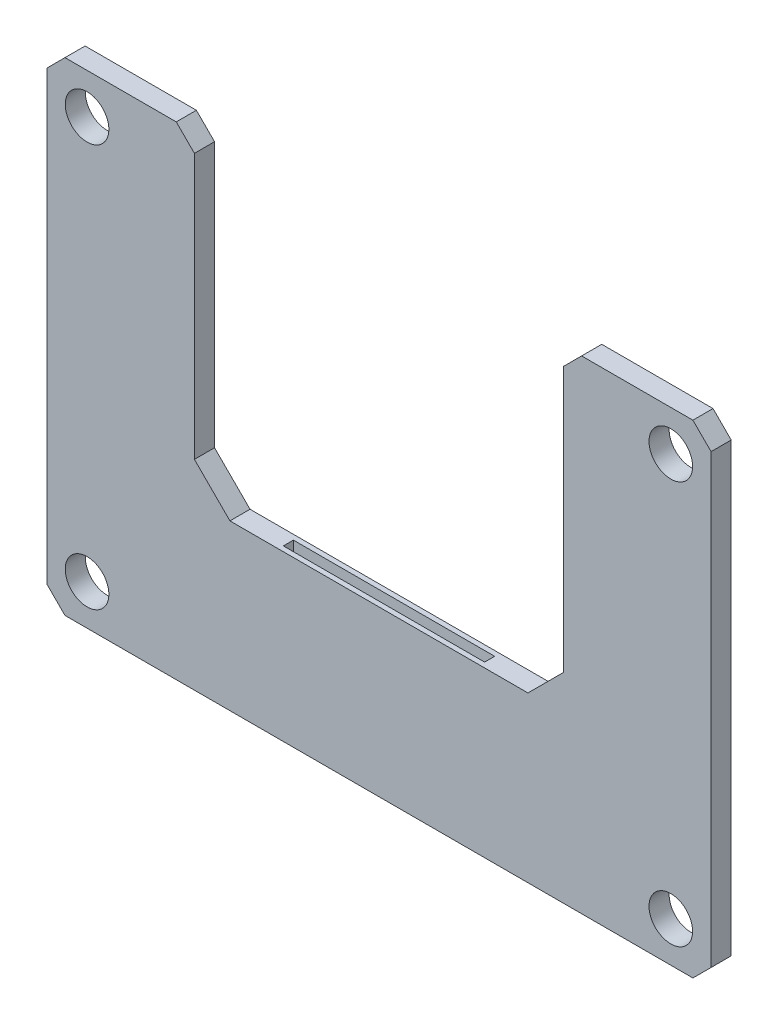
ISO-10303-21;
HEADER;
FILE_DESCRIPTION(('STEP AP214'),'2;1');
FILE_NAME('part.step','',(''),(''),'','','');
FILE_SCHEMA(('AUTOMOTIVE_DESIGN { 1 0 10303 214 1 1 1 1 }'));
ENDSEC;
DATA;
#1=APPLICATION_CONTEXT('core data for automotive mechanical design processes');
#2=APPLICATION_PROTOCOL_DEFINITION('international standard','automotive_design',2000,#1);
#3=PRODUCT_CONTEXT('',#1,'mechanical');
#4=PRODUCT('Part','Part','',(#3));
#5=PRODUCT_RELATED_PRODUCT_CATEGORY('part','',(#4));
#6=PRODUCT_DEFINITION_FORMATION('','',#4);
#7=PRODUCT_DEFINITION_CONTEXT('part definition',#1,'design');
#8=PRODUCT_DEFINITION('design','',#6,#7);
#9=PRODUCT_DEFINITION_SHAPE('','',#8);
#10=(LENGTH_UNIT() NAMED_UNIT(*) SI_UNIT(.MILLI.,.METRE.));
#11=(NAMED_UNIT(*) PLANE_ANGLE_UNIT() SI_UNIT($,.RADIAN.));
#12=(NAMED_UNIT(*) SI_UNIT($,.STERADIAN.) SOLID_ANGLE_UNIT());
#13=UNCERTAINTY_MEASURE_WITH_UNIT(LENGTH_MEASURE(1.E-05),#10,'distance_accuracy_value','');
#14=(GEOMETRIC_REPRESENTATION_CONTEXT(3) GLOBAL_UNCERTAINTY_ASSIGNED_CONTEXT((#13)) GLOBAL_UNIT_ASSIGNED_CONTEXT((#10,
#11,#12)) REPRESENTATION_CONTEXT('',''));
#15=CARTESIAN_POINT('',(0.,0.,0.));
#16=DIRECTION('',(0.,0.,1.));
#17=DIRECTION('',(1.,0.,0.));
#18=AXIS2_PLACEMENT_3D('',#15,#16,#17);
#19=CARTESIAN_POINT('',(0.,0.,3.));
#20=DIRECTION('',(0.,0.,-1.));
#21=DIRECTION('',(-1.,0.,0.));
#22=AXIS2_PLACEMENT_3D('',#19,#20,#21);
#23=PLANE('',#22);
#24=DIRECTION('',(-0.707106781186538,-0.707106781186557,0.));
#25=VECTOR('',#24,1.);
#26=CARTESIAN_POINT('',(-22.5,30.2928932188135,3.));
#27=LINE('',#26,#25);
#28=CARTESIAN_POINT('',(-22.5,30.2928932188135,3.));
#29=VERTEX_POINT('',#28);
#30=CARTESIAN_POINT('',(-27.7928932188133,25.,3.));
#31=VERTEX_POINT('',#30);
#32=EDGE_CURVE('E231',#29,#31,#27,.T.);
#33=ORIENTED_EDGE('',*,*,#32,.T.);
#34=DIRECTION('',(-1.,0.,0.));
#35=VECTOR('',#34,1.);
#36=CARTESIAN_POINT('',(-27.7928932188133,25.,3.));
#37=LINE('',#36,#35);
#38=CARTESIAN_POINT('',(-72.2071067811864,25.,3.));
#39=VERTEX_POINT('',#38);
#40=EDGE_CURVE('E234',#31,#39,#37,.T.);
#41=ORIENTED_EDGE('',*,*,#40,.T.);
#42=DIRECTION('',(-0.707106781186558,0.707106781186537,0.));
#43=VECTOR('',#42,1.);
#44=CARTESIAN_POINT('',(-72.2071067811864,25.,3.));
#45=LINE('',#44,#43);
#46=CARTESIAN_POINT('',(-77.5,30.2928932188134,3.));
#47=VERTEX_POINT('',#46);
#48=EDGE_CURVE('E237',#39,#47,#45,.T.);
#49=ORIENTED_EDGE('',*,*,#48,.T.);
#50=DIRECTION('',(0.,1.,0.));
#51=VECTOR('',#50,1.);
#52=CARTESIAN_POINT('',(-77.5,30.2928932188134,3.));
#53=LINE('',#52,#51);
#54=CARTESIAN_POINT('',(-77.5,69.7928932188135,3.));
#55=VERTEX_POINT('',#54);
#56=EDGE_CURVE('E239',#47,#55,#53,.T.);
#57=ORIENTED_EDGE('',*,*,#56,.T.);
#58=DIRECTION('',(-0.707106781186544,0.707106781186551,0.));
#59=VECTOR('',#58,1.);
#60=CARTESIAN_POINT('',(-77.5,69.7928932188135,3.));
#61=LINE('',#60,#59);
#62=CARTESIAN_POINT('',(-80.2071067811865,72.5,3.));
#63=VERTEX_POINT('',#62);
#64=EDGE_CURVE('E241',#55,#63,#61,.T.);
#65=ORIENTED_EDGE('',*,*,#64,.T.);
#66=DIRECTION('',(-1.,0.,0.));
#67=VECTOR('',#66,1.);
#68=CARTESIAN_POINT('',(-80.2071067811865,72.5,3.));
#69=LINE('',#68,#67);
#70=CARTESIAN_POINT('',(-96.7928932188135,72.5,3.));
#71=VERTEX_POINT('',#70);
#72=EDGE_CURVE('E243',#63,#71,#69,.T.);
#73=ORIENTED_EDGE('',*,*,#72,.T.);
#74=DIRECTION('',(-0.707106781186544,-0.707106781186551,0.));
#75=VECTOR('',#74,1.);
#76=CARTESIAN_POINT('',(-96.7928932188135,72.5,3.));
#77=LINE('',#76,#75);
#78=CARTESIAN_POINT('',(-99.5,69.7928932188134,3.));
#79=VERTEX_POINT('',#78);
#80=EDGE_CURVE('E245',#71,#79,#77,.T.);
#81=ORIENTED_EDGE('',*,*,#80,.T.);
#82=DIRECTION('',(0.,-1.,0.));
#83=VECTOR('',#82,1.);
#84=CARTESIAN_POINT('',(-99.5,69.7928932188134,3.));
#85=LINE('',#84,#83);
#86=CARTESIAN_POINT('',(-99.5,3.20710678118654,3.));
#87=VERTEX_POINT('',#86);
#88=EDGE_CURVE('E247',#79,#87,#85,.T.);
#89=ORIENTED_EDGE('',*,*,#88,.T.);
#90=DIRECTION('',(0.707106781186548,-0.707106781186547,0.));
#91=VECTOR('',#90,1.);
#92=CARTESIAN_POINT('',(-99.5,3.20710678118654,3.));
#93=LINE('',#92,#91);
#94=CARTESIAN_POINT('',(-96.7928932188135,0.499999999999987,3.));
#95=VERTEX_POINT('',#94);
#96=EDGE_CURVE('E249',#87,#95,#93,.T.);
#97=ORIENTED_EDGE('',*,*,#96,.T.);
#98=DIRECTION('',(1.,0.,0.));
#99=VECTOR('',#98,1.);
#100=CARTESIAN_POINT('',(-96.7928932188135,0.499999999999987,3.));
#101=LINE('',#100,#99);
#102=CARTESIAN_POINT('',(-3.20710678118658,0.499999999999998,3.));
#103=VERTEX_POINT('',#102);
#104=EDGE_CURVE('E251',#95,#103,#101,.T.);
#105=ORIENTED_EDGE('',*,*,#104,.T.);
#106=DIRECTION('',(0.707106781186547,0.707106781186547,0.));
#107=VECTOR('',#106,1.);
#108=CARTESIAN_POINT('',(-3.20710678118658,0.499999999999998,3.));
#109=LINE('',#108,#107);
#110=CARTESIAN_POINT('',(-0.499999999999998,3.20710678118658,3.));
#111=VERTEX_POINT('',#110);
#112=EDGE_CURVE('E253',#103,#111,#109,.T.);
#113=ORIENTED_EDGE('',*,*,#112,.T.);
#114=DIRECTION('',(0.,1.,0.));
#115=VECTOR('',#114,1.);
#116=CARTESIAN_POINT('',(-0.499999999999998,3.20710678118658,3.));
#117=LINE('',#116,#115);
#118=CARTESIAN_POINT('',(-0.499999999999998,69.7928932188135,3.));
#119=VERTEX_POINT('',#118);
#120=EDGE_CURVE('E255',#111,#119,#117,.T.);
#121=ORIENTED_EDGE('',*,*,#120,.T.);
#122=DIRECTION('',(-0.707106781186551,0.707106781186544,0.));
#123=VECTOR('',#122,1.);
#124=CARTESIAN_POINT('',(-0.499999999999998,69.7928932188135,3.));
#125=LINE('',#124,#123);
#126=CARTESIAN_POINT('',(-3.20710678118656,72.5,3.));
#127=VERTEX_POINT('',#126);
#128=EDGE_CURVE('E257',#119,#127,#125,.T.);
#129=ORIENTED_EDGE('',*,*,#128,.T.);
#130=DIRECTION('',(-1.,0.,0.));
#131=VECTOR('',#130,1.);
#132=CARTESIAN_POINT('',(-3.20710678118656,72.5,3.));
#133=LINE('',#132,#131);
#134=CARTESIAN_POINT('',(-19.7928932188135,72.5,3.));
#135=VERTEX_POINT('',#134);
#136=EDGE_CURVE('E259',#127,#135,#133,.T.);
#137=ORIENTED_EDGE('',*,*,#136,.T.);
#138=DIRECTION('',(-0.707106781186552,-0.707106781186543,0.));
#139=VECTOR('',#138,1.);
#140=CARTESIAN_POINT('',(-19.7928932188135,72.5,3.));
#141=LINE('',#140,#139);
#142=CARTESIAN_POINT('',(-22.5,69.7928932188135,3.));
#143=VERTEX_POINT('',#142);
#144=EDGE_CURVE('E261',#135,#143,#141,.T.);
#145=ORIENTED_EDGE('',*,*,#144,.T.);
#146=DIRECTION('',(0.,-1.,0.));
#147=VECTOR('',#146,1.);
#148=CARTESIAN_POINT('',(-22.5,69.7928932188135,3.));
#149=LINE('',#148,#147);
#150=EDGE_CURVE('E263',#143,#29,#149,.T.);
#151=ORIENTED_EDGE('',*,*,#150,.T.);
#152=EDGE_LOOP('',(#33,#41,#49,#57,#65,#73,#81,#89,#97,#105,#113,#121,#129,#137,#145,#151));
#153=FACE_BOUND('',#152,.T.);
#154=CARTESIAN_POINT('',(-6.49999999999982,66.4999999999996,3.));
#155=DIRECTION('',(0.,0.,1.));
#156=DIRECTION('',(1.,0.,0.));
#157=AXIS2_PLACEMENT_3D('',#154,#155,#156);
#158=CIRCLE('',#157,3.25);
#159=CARTESIAN_POINT('',(-3.24999999999982,66.4999999999996,3.));
#160=VERTEX_POINT('',#159);
#161=EDGE_CURVE('E225',#160,#160,#158,.T.);
#162=ORIENTED_EDGE('',*,*,#161,.F.);
#163=EDGE_LOOP('',(#162));
#164=FACE_BOUND('',#163,.T.);
#165=CARTESIAN_POINT('',(-6.49999999999999,6.49999999999999,3.));
#166=DIRECTION('',(0.,0.,1.));
#167=DIRECTION('',(1.,0.,0.));
#168=AXIS2_PLACEMENT_3D('',#165,#166,#167);
#169=CIRCLE('',#168,3.25);
#170=CARTESIAN_POINT('',(-3.24999999999999,6.49999999999999,3.));
#171=VERTEX_POINT('',#170);
#172=EDGE_CURVE('E219',#171,#171,#169,.T.);
#173=ORIENTED_EDGE('',*,*,#172,.F.);
#174=EDGE_LOOP('',(#173));
#175=FACE_BOUND('',#174,.T.);
#176=CARTESIAN_POINT('',(-93.5,6.49999999999999,3.));
#177=DIRECTION('',(0.,0.,1.));
#178=DIRECTION('',(1.,0.,0.));
#179=AXIS2_PLACEMENT_3D('',#176,#177,#178);
#180=CIRCLE('',#179,3.25000000000001);
#181=CARTESIAN_POINT('',(-90.25,6.49999999999999,3.));
#182=VERTEX_POINT('',#181);
#183=EDGE_CURVE('E213',#182,#182,#180,.T.);
#184=ORIENTED_EDGE('',*,*,#183,.F.);
#185=EDGE_LOOP('',(#184));
#186=FACE_BOUND('',#185,.T.);
#187=CARTESIAN_POINT('',(-93.5,66.4999999999996,3.));
#188=DIRECTION('',(0.,0.,1.));
#189=DIRECTION('',(1.,0.,0.));
#190=AXIS2_PLACEMENT_3D('',#187,#188,#189);
#191=CIRCLE('',#190,3.25000000000001);
#192=CARTESIAN_POINT('',(-90.25,66.4999999999996,3.));
#193=VERTEX_POINT('',#192);
#194=EDGE_CURVE('E207',#193,#193,#191,.T.);
#195=ORIENTED_EDGE('',*,*,#194,.F.);
#196=EDGE_LOOP('',(#195));
#197=FACE_BOUND('',#196,.T.);
#198=ADVANCED_FACE('F33',(#153,#164,#175,#186,#197),#23,.F.);
#199=CARTESIAN_POINT('',(0.,0.,0.));
#200=DIRECTION('',(0.,0.,-1.));
#201=DIRECTION('',(-1.,0.,0.));
#202=AXIS2_PLACEMENT_3D('',#199,#200,#201);
#203=PLANE('',#202);
#204=CARTESIAN_POINT('',(-93.5,6.49999999999999,0.));
#205=DIRECTION('',(0.,0.,1.));
#206=DIRECTION('',(1.,0.,0.));
#207=AXIS2_PLACEMENT_3D('',#204,#205,#206);
#208=CIRCLE('',#207,3.25000000000001);
#209=CARTESIAN_POINT('',(-90.25,6.49999999999999,0.));
#210=VERTEX_POINT('',#209);
#211=EDGE_CURVE('E210',#210,#210,#208,.T.);
#212=ORIENTED_EDGE('',*,*,#211,.T.);
#213=EDGE_LOOP('',(#212));
#214=FACE_BOUND('',#213,.T.);
#215=CARTESIAN_POINT('',(-6.49999999999982,66.4999999999996,0.));
#216=DIRECTION('',(0.,0.,1.));
#217=DIRECTION('',(1.,0.,0.));
#218=AXIS2_PLACEMENT_3D('',#215,#216,#217);
#219=CIRCLE('',#218,3.25);
#220=CARTESIAN_POINT('',(-3.24999999999982,66.4999999999996,0.));
#221=VERTEX_POINT('',#220);
#222=EDGE_CURVE('E222',#221,#221,#219,.T.);
#223=ORIENTED_EDGE('',*,*,#222,.T.);
#224=EDGE_LOOP('',(#223));
#225=FACE_BOUND('',#224,.T.);
#226=DIRECTION('',(-0.707106781186538,-0.707106781186557,0.));
#227=VECTOR('',#226,1.);
#228=CARTESIAN_POINT('',(-22.5,30.2928932188135,0.));
#229=LINE('',#228,#227);
#230=CARTESIAN_POINT('',(-22.5,30.2928932188135,0.));
#231=VERTEX_POINT('',#230);
#232=CARTESIAN_POINT('',(-27.7928932188133,25.,0.));
#233=VERTEX_POINT('',#232);
#234=EDGE_CURVE('E228',#231,#233,#229,.T.);
#235=ORIENTED_EDGE('',*,*,#234,.F.);
#236=DIRECTION('',(0.,-1.,0.));
#237=VECTOR('',#236,1.);
#238=CARTESIAN_POINT('',(-22.5,69.7928932188135,0.));
#239=LINE('',#238,#237);
#240=CARTESIAN_POINT('',(-22.5,69.7928932188135,0.));
#241=VERTEX_POINT('',#240);
#242=EDGE_CURVE('E235',#241,#231,#239,.T.);
#243=ORIENTED_EDGE('',*,*,#242,.F.);
#244=DIRECTION('',(-0.707106781186552,-0.707106781186543,0.));
#245=VECTOR('',#244,1.);
#246=CARTESIAN_POINT('',(-19.7928932188135,72.5,0.));
#247=LINE('',#246,#245);
#248=CARTESIAN_POINT('',(-19.7928932188135,72.5,0.));
#249=VERTEX_POINT('',#248);
#250=EDGE_CURVE('E295',#249,#241,#247,.T.);
#251=ORIENTED_EDGE('',*,*,#250,.F.);
#252=DIRECTION('',(-1.,0.,0.));
#253=VECTOR('',#252,1.);
#254=CARTESIAN_POINT('',(-3.20710678118656,72.5,0.));
#255=LINE('',#254,#253);
#256=CARTESIAN_POINT('',(-3.20710678118656,72.5,0.));
#257=VERTEX_POINT('',#256);
#258=EDGE_CURVE('E293',#257,#249,#255,.T.);
#259=ORIENTED_EDGE('',*,*,#258,.F.);
#260=DIRECTION('',(-0.707106781186551,0.707106781186544,0.));
#261=VECTOR('',#260,1.);
#262=CARTESIAN_POINT('',(-0.499999999999998,69.7928932188135,0.));
#263=LINE('',#262,#261);
#264=CARTESIAN_POINT('',(-0.499999999999998,69.7928932188135,0.));
#265=VERTEX_POINT('',#264);
#266=EDGE_CURVE('E291',#265,#257,#263,.T.);
#267=ORIENTED_EDGE('',*,*,#266,.F.);
#268=DIRECTION('',(0.,1.,0.));
#269=VECTOR('',#268,1.);
#270=CARTESIAN_POINT('',(-0.499999999999998,3.20710678118658,0.));
#271=LINE('',#270,#269);
#272=CARTESIAN_POINT('',(-0.499999999999998,3.20710678118658,0.));
#273=VERTEX_POINT('',#272);
#274=EDGE_CURVE('E289',#273,#265,#271,.T.);
#275=ORIENTED_EDGE('',*,*,#274,.F.);
#276=DIRECTION('',(0.707106781186547,0.707106781186547,0.));
#277=VECTOR('',#276,1.);
#278=CARTESIAN_POINT('',(-3.20710678118658,0.499999999999998,0.));
#279=LINE('',#278,#277);
#280=CARTESIAN_POINT('',(-3.20710678118658,0.499999999999998,0.));
#281=VERTEX_POINT('',#280);
#282=EDGE_CURVE('E287',#281,#273,#279,.T.);
#283=ORIENTED_EDGE('',*,*,#282,.F.);
#284=DIRECTION('',(1.,0.,0.));
#285=VECTOR('',#284,1.);
#286=CARTESIAN_POINT('',(-50.7602400954426,0.5,0.));
#287=LINE('',#286,#285);
#288=CARTESIAN_POINT('',(-96.7928932188135,0.499999999999987,0.));
#289=VERTEX_POINT('',#288);
#290=EDGE_CURVE('E285',#289,#281,#287,.T.);
#291=ORIENTED_EDGE('',*,*,#290,.F.);
#292=DIRECTION('',(0.707106781186548,-0.707106781186547,0.));
#293=VECTOR('',#292,1.);
#294=CARTESIAN_POINT('',(-99.5,3.20710678118654,0.));
#295=LINE('',#294,#293);
#296=CARTESIAN_POINT('',(-99.5,3.20710678118654,0.));
#297=VERTEX_POINT('',#296);
#298=EDGE_CURVE('E282',#297,#289,#295,.T.);
#299=ORIENTED_EDGE('',*,*,#298,.F.);
#300=DIRECTION('',(0.,-1.,0.));
#301=VECTOR('',#300,1.);
#302=CARTESIAN_POINT('',(-99.5,69.7928932188134,0.));
#303=LINE('',#302,#301);
#304=CARTESIAN_POINT('',(-99.5,69.7928932188134,0.));
#305=VERTEX_POINT('',#304);
#306=EDGE_CURVE('E280',#305,#297,#303,.T.);
#307=ORIENTED_EDGE('',*,*,#306,.F.);
#308=DIRECTION('',(-0.707106781186544,-0.707106781186551,0.));
#309=VECTOR('',#308,1.);
#310=CARTESIAN_POINT('',(-96.7928932188135,72.5,0.));
#311=LINE('',#310,#309);
#312=CARTESIAN_POINT('',(-96.7928932188135,72.5,0.));
#313=VERTEX_POINT('',#312);
#314=EDGE_CURVE('E278',#313,#305,#311,.T.);
#315=ORIENTED_EDGE('',*,*,#314,.F.);
#316=DIRECTION('',(-1.,0.,0.));
#317=VECTOR('',#316,1.);
#318=CARTESIAN_POINT('',(-80.2071067811865,72.5,0.));
#319=LINE('',#318,#317);
#320=CARTESIAN_POINT('',(-80.2071067811865,72.5,0.));
#321=VERTEX_POINT('',#320);
#322=EDGE_CURVE('E276',#321,#313,#319,.T.);
#323=ORIENTED_EDGE('',*,*,#322,.F.);
#324=DIRECTION('',(-0.707106781186544,0.707106781186551,0.));
#325=VECTOR('',#324,1.);
#326=CARTESIAN_POINT('',(-77.5,69.7928932188135,0.));
#327=LINE('',#326,#325);
#328=CARTESIAN_POINT('',(-77.5,69.7928932188135,0.));
#329=VERTEX_POINT('',#328);
#330=EDGE_CURVE('E274',#329,#321,#327,.T.);
#331=ORIENTED_EDGE('',*,*,#330,.F.);
#332=DIRECTION('',(0.,1.,0.));
#333=VECTOR('',#332,1.);
#334=CARTESIAN_POINT('',(-77.5,30.2928932188134,0.));
#335=LINE('',#334,#333);
#336=CARTESIAN_POINT('',(-77.5,30.2928932188134,0.));
#337=VERTEX_POINT('',#336);
#338=EDGE_CURVE('E272',#337,#329,#335,.T.);
#339=ORIENTED_EDGE('',*,*,#338,.F.);
#340=DIRECTION('',(-0.707106781186558,0.707106781186537,0.));
#341=VECTOR('',#340,1.);
#342=CARTESIAN_POINT('',(-72.2071067811864,25.,0.));
#343=LINE('',#342,#341);
#344=CARTESIAN_POINT('',(-72.2071067811864,25.,0.));
#345=VERTEX_POINT('',#344);
#346=EDGE_CURVE('E270',#345,#337,#343,.T.);
#347=ORIENTED_EDGE('',*,*,#346,.F.);
#348=DIRECTION('',(-1.,0.,0.));
#349=VECTOR('',#348,1.);
#350=CARTESIAN_POINT('',(-45.5,25.,0.));
#351=LINE('',#350,#349);
#352=EDGE_CURVE('E268',#233,#345,#351,.T.);
#353=ORIENTED_EDGE('',*,*,#352,.F.);
#354=EDGE_LOOP('',(#235,#243,#251,#259,#267,#275,#283,#291,#299,#307,#315,#323,#331,#339,#347,#353));
#355=FACE_BOUND('',#354,.T.);
#356=CARTESIAN_POINT('',(-6.49999999999999,6.49999999999999,0.));
#357=DIRECTION('',(0.,0.,1.));
#358=DIRECTION('',(1.,0.,0.));
#359=AXIS2_PLACEMENT_3D('',#356,#357,#358);
#360=CIRCLE('',#359,3.25);
#361=CARTESIAN_POINT('',(-3.24999999999999,6.49999999999999,0.));
#362=VERTEX_POINT('',#361);
#363=EDGE_CURVE('E216',#362,#362,#360,.T.);
#364=ORIENTED_EDGE('',*,*,#363,.T.);
#365=EDGE_LOOP('',(#364));
#366=FACE_BOUND('',#365,.T.);
#367=CARTESIAN_POINT('',(-93.5,66.4999999999996,0.));
#368=DIRECTION('',(0.,0.,1.));
#369=DIRECTION('',(1.,0.,0.));
#370=AXIS2_PLACEMENT_3D('',#367,#368,#369);
#371=CIRCLE('',#370,3.25000000000001);
#372=CARTESIAN_POINT('',(-90.25,66.4999999999996,0.));
#373=VERTEX_POINT('',#372);
#374=EDGE_CURVE('E184',#373,#373,#371,.T.);
#375=ORIENTED_EDGE('',*,*,#374,.T.);
#376=EDGE_LOOP('',(#375));
#377=FACE_BOUND('',#376,.T.);
#378=ADVANCED_FACE('F348',(#214,#225,#355,#366,#377),#203,.T.);
#379=CARTESIAN_POINT('',(-22.5,30.2928932188135,3.));
#380=DIRECTION('',(0.707106781186557,-0.707106781186538,0.));
#381=DIRECTION('',(0.707106781186538,0.707106781186557,0.));
#382=AXIS2_PLACEMENT_3D('',#379,#380,#381);
#383=PLANE('',#382);
#384=ORIENTED_EDGE('',*,*,#234,.T.);
#385=DIRECTION('',(0.,0.,-1.));
#386=VECTOR('',#385,1.);
#387=CARTESIAN_POINT('',(-27.7928932188133,25.,3.));
#388=LINE('',#387,#386);
#389=EDGE_CURVE('E11',#31,#233,#388,.T.);
#390=ORIENTED_EDGE('',*,*,#389,.F.);
#391=ORIENTED_EDGE('',*,*,#32,.F.);
#392=DIRECTION('',(0.,0.,-1.));
#393=VECTOR('',#392,1.);
#394=CARTESIAN_POINT('',(-22.5,30.2928932188135,3.));
#395=LINE('',#394,#393);
#396=EDGE_CURVE('E265',#29,#231,#395,.T.);
#397=ORIENTED_EDGE('',*,*,#396,.T.);
#398=EDGE_LOOP('',(#384,#390,#391,#397));
#399=FACE_BOUND('',#398,.T.);
#400=ADVANCED_FACE('F35',(#399),#383,.F.);
#401=CARTESIAN_POINT('',(-45.5,25.,3.));
#402=DIRECTION('',(0.,-1.,0.));
#403=DIRECTION('',(1.,0.,0.));
#404=AXIS2_PLACEMENT_3D('',#401,#402,#403);
#405=PLANE('',#404);
#406=DIRECTION('',(1.,0.,0.));
#407=VECTOR('',#406,1.);
#408=CARTESIAN_POINT('',(-35.,25.,2.25));
#409=LINE('',#408,#407);
#410=CARTESIAN_POINT('',(-65.,25.,2.25));
#411=VERTEX_POINT('',#410);
#412=CARTESIAN_POINT('',(-35.,25.,2.25));
#413=VERTEX_POINT('',#412);
#414=EDGE_CURVE('E190',#411,#413,#409,.T.);
#415=ORIENTED_EDGE('',*,*,#414,.F.);
#416=DIRECTION('',(0.,0.,1.));
#417=VECTOR('',#416,1.);
#418=CARTESIAN_POINT('',(-65.,25.,0.750000000000001));
#419=LINE('',#418,#417);
#420=CARTESIAN_POINT('',(-65.,25.,0.750000000000001));
#421=VERTEX_POINT('',#420);
#422=EDGE_CURVE('E172',#421,#411,#419,.T.);
#423=ORIENTED_EDGE('',*,*,#422,.F.);
#424=DIRECTION('',(-1.,0.,0.));
#425=VECTOR('',#424,1.);
#426=CARTESIAN_POINT('',(-35.,25.,0.750000000000004));
#427=LINE('',#426,#425);
#428=CARTESIAN_POINT('',(-35.,25.,0.750000000000004));
#429=VERTEX_POINT('',#428);
#430=EDGE_CURVE('E181',#429,#421,#427,.T.);
#431=ORIENTED_EDGE('',*,*,#430,.F.);
#432=DIRECTION('',(0.,0.,-1.));
#433=VECTOR('',#432,1.);
#434=CARTESIAN_POINT('',(-35.,25.,0.750000000000004));
#435=LINE('',#434,#433);
#436=EDGE_CURVE('E48',#413,#429,#435,.T.);
#437=ORIENTED_EDGE('',*,*,#436,.F.);
#438=EDGE_LOOP('',(#415,#423,#431,#437));
#439=FACE_BOUND('',#438,.T.);
#440=ORIENTED_EDGE('',*,*,#352,.T.);
#441=DIRECTION('',(0.,0.,-1.));
#442=VECTOR('',#441,1.);
#443=CARTESIAN_POINT('',(-72.2071067811864,25.,3.));
#444=LINE('',#443,#442);
#445=EDGE_CURVE('E41',#39,#345,#444,.T.);
#446=ORIENTED_EDGE('',*,*,#445,.F.);
#447=ORIENTED_EDGE('',*,*,#40,.F.);
#448=ORIENTED_EDGE('',*,*,#389,.T.);
#449=EDGE_LOOP('',(#440,#446,#447,#448));
#450=FACE_BOUND('',#449,.T.);
#451=ADVANCED_FACE('F187',(#439,#450),#405,.F.);
#452=CARTESIAN_POINT('',(-72.2071067811864,25.,3.));
#453=DIRECTION('',(-0.707106781186537,-0.707106781186558,0.));
#454=DIRECTION('',(0.707106781186558,-0.707106781186537,0.));
#455=AXIS2_PLACEMENT_3D('',#452,#453,#454);
#456=PLANE('',#455);
#457=ORIENTED_EDGE('',*,*,#346,.T.);
#458=DIRECTION('',(0.,0.,-1.));
#459=VECTOR('',#458,1.);
#460=CARTESIAN_POINT('',(-77.5,30.2928932188134,3.));
#461=LINE('',#460,#459);
#462=EDGE_CURVE('E336',#47,#337,#461,.T.);
#463=ORIENTED_EDGE('',*,*,#462,.F.);
#464=ORIENTED_EDGE('',*,*,#48,.F.);
#465=ORIENTED_EDGE('',*,*,#445,.T.);
#466=EDGE_LOOP('',(#457,#463,#464,#465));
#467=FACE_BOUND('',#466,.T.);
#468=ADVANCED_FACE('F343',(#467),#456,.F.);
#469=CARTESIAN_POINT('',(-77.5,30.2928932188134,3.));
#470=DIRECTION('',(-1.,0.,0.));
#471=DIRECTION('',(0.,0.,1.));
#472=AXIS2_PLACEMENT_3D('',#469,#470,#471);
#473=PLANE('',#472);
#474=ORIENTED_EDGE('',*,*,#338,.T.);
#475=DIRECTION('',(0.,0.,-1.));
#476=VECTOR('',#475,1.);
#477=CARTESIAN_POINT('',(-77.5,69.7928932188135,3.));
#478=LINE('',#477,#476);
#479=EDGE_CURVE('E333',#55,#329,#478,.T.);
#480=ORIENTED_EDGE('',*,*,#479,.F.);
#481=ORIENTED_EDGE('',*,*,#56,.F.);
#482=ORIENTED_EDGE('',*,*,#462,.T.);
#483=EDGE_LOOP('',(#474,#480,#481,#482));
#484=FACE_BOUND('',#483,.T.);
#485=ADVANCED_FACE('F354',(#484),#473,.F.);
#486=CARTESIAN_POINT('',(-77.5,69.7928932188135,3.));
#487=DIRECTION('',(-0.707106781186551,-0.707106781186544,0.));
#488=DIRECTION('',(0.707106781186544,-0.707106781186551,0.));
#489=AXIS2_PLACEMENT_3D('',#486,#487,#488);
#490=PLANE('',#489);
#491=ORIENTED_EDGE('',*,*,#330,.T.);
#492=DIRECTION('',(0.,0.,-1.));
#493=VECTOR('',#492,1.);
#494=CARTESIAN_POINT('',(-80.2071067811865,72.5,3.));
#495=LINE('',#494,#493);
#496=EDGE_CURVE('E330',#63,#321,#495,.T.);
#497=ORIENTED_EDGE('',*,*,#496,.F.);
#498=ORIENTED_EDGE('',*,*,#64,.F.);
#499=ORIENTED_EDGE('',*,*,#479,.T.);
#500=EDGE_LOOP('',(#491,#497,#498,#499));
#501=FACE_BOUND('',#500,.T.);
#502=ADVANCED_FACE('F358',(#501),#490,.F.);
#503=CARTESIAN_POINT('',(-80.2071067811865,72.5,3.));
#504=DIRECTION('',(0.,-1.,0.));
#505=DIRECTION('',(0.,0.,-1.));
#506=AXIS2_PLACEMENT_3D('',#503,#504,#505);
#507=PLANE('',#506);
#508=ORIENTED_EDGE('',*,*,#322,.T.);
#509=DIRECTION('',(0.,0.,-1.));
#510=VECTOR('',#509,1.);
#511=CARTESIAN_POINT('',(-96.7928932188135,72.5,3.));
#512=LINE('',#511,#510);
#513=EDGE_CURVE('E327',#71,#313,#512,.T.);
#514=ORIENTED_EDGE('',*,*,#513,.F.);
#515=ORIENTED_EDGE('',*,*,#72,.F.);
#516=ORIENTED_EDGE('',*,*,#496,.T.);
#517=EDGE_LOOP('',(#508,#514,#515,#516));
#518=FACE_BOUND('',#517,.T.);
#519=ADVANCED_FACE('F417',(#518),#507,.F.);
#520=CARTESIAN_POINT('',(-96.7928932188135,72.5,3.));
#521=DIRECTION('',(0.707106781186551,-0.707106781186544,0.));
#522=DIRECTION('',(0.707106781186544,0.707106781186551,0.));
#523=AXIS2_PLACEMENT_3D('',#520,#521,#522);
#524=PLANE('',#523);
#525=ORIENTED_EDGE('',*,*,#314,.T.);
#526=DIRECTION('',(0.,0.,-1.));
#527=VECTOR('',#526,1.);
#528=CARTESIAN_POINT('',(-99.5,69.7928932188134,3.));
#529=LINE('',#528,#527);
#530=EDGE_CURVE('E324',#79,#305,#529,.T.);
#531=ORIENTED_EDGE('',*,*,#530,.F.);
#532=ORIENTED_EDGE('',*,*,#80,.F.);
#533=ORIENTED_EDGE('',*,*,#513,.T.);
#534=EDGE_LOOP('',(#525,#531,#532,#533));
#535=FACE_BOUND('',#534,.T.);
#536=ADVANCED_FACE('F415',(#535),#524,.F.);
#537=CARTESIAN_POINT('',(-99.5,69.7928932188134,3.));
#538=DIRECTION('',(1.,0.,0.));
#539=DIRECTION('',(0.,0.,-1.));
#540=AXIS2_PLACEMENT_3D('',#537,#538,#539);
#541=PLANE('',#540);
#542=ORIENTED_EDGE('',*,*,#306,.T.);
#543=DIRECTION('',(0.,0.,-1.));
#544=VECTOR('',#543,1.);
#545=CARTESIAN_POINT('',(-99.5,3.20710678118654,3.));
#546=LINE('',#545,#544);
#547=EDGE_CURVE('E321',#87,#297,#546,.T.);
#548=ORIENTED_EDGE('',*,*,#547,.F.);
#549=ORIENTED_EDGE('',*,*,#88,.F.);
#550=ORIENTED_EDGE('',*,*,#530,.T.);
#551=EDGE_LOOP('',(#542,#548,#549,#550));
#552=FACE_BOUND('',#551,.T.);
#553=ADVANCED_FACE('F412',(#552),#541,.F.);
#554=CARTESIAN_POINT('',(-99.5,3.20710678118654,3.));
#555=DIRECTION('',(0.707106781186547,0.707106781186548,0.));
#556=DIRECTION('',(-0.707106781186548,0.707106781186547,0.));
#557=AXIS2_PLACEMENT_3D('',#554,#555,#556);
#558=PLANE('',#557);
#559=ORIENTED_EDGE('',*,*,#298,.T.);
#560=DIRECTION('',(0.,0.,-1.));
#561=VECTOR('',#560,1.);
#562=CARTESIAN_POINT('',(-96.7928932188135,0.499999999999987,3.));
#563=LINE('',#562,#561);
#564=EDGE_CURVE('E318',#95,#289,#563,.T.);
#565=ORIENTED_EDGE('',*,*,#564,.F.);
#566=ORIENTED_EDGE('',*,*,#96,.F.);
#567=ORIENTED_EDGE('',*,*,#547,.T.);
#568=EDGE_LOOP('',(#559,#565,#566,#567));
#569=FACE_BOUND('',#568,.T.);
#570=ADVANCED_FACE('F403',(#569),#558,.F.);
#571=CARTESIAN_POINT('',(-50.7602400954426,0.5,3.));
#572=DIRECTION('',(0.,1.,0.));
#573=DIRECTION('',(-1.,0.,0.));
#574=AXIS2_PLACEMENT_3D('',#571,#572,#573);
#575=PLANE('',#574);
#576=DIRECTION('',(1.,0.,0.));
#577=VECTOR('',#576,1.);
#578=CARTESIAN_POINT('',(-35.,0.5,0.750000000000004));
#579=LINE('',#578,#577);
#580=CARTESIAN_POINT('',(-65.,0.500000000000001,0.750000000000001));
#581=VERTEX_POINT('',#580);
#582=CARTESIAN_POINT('',(-35.,0.5,0.750000000000004));
#583=VERTEX_POINT('',#582);
#584=EDGE_CURVE('E192',#581,#583,#579,.T.);
#585=ORIENTED_EDGE('',*,*,#584,.F.);
#586=DIRECTION('',(0.,0.,-1.));
#587=VECTOR('',#586,1.);
#588=CARTESIAN_POINT('',(-65.,0.500000000000001,0.750000000000001));
#589=LINE('',#588,#587);
#590=CARTESIAN_POINT('',(-65.,0.500000000000001,2.25));
#591=VERTEX_POINT('',#590);
#592=EDGE_CURVE('E56',#591,#581,#589,.T.);
#593=ORIENTED_EDGE('',*,*,#592,.F.);
#594=DIRECTION('',(-1.,0.,0.));
#595=VECTOR('',#594,1.);
#596=CARTESIAN_POINT('',(-35.,0.5,2.25));
#597=LINE('',#596,#595);
#598=CARTESIAN_POINT('',(-35.,0.5,2.25));
#599=VERTEX_POINT('',#598);
#600=EDGE_CURVE('E178',#599,#591,#597,.T.);
#601=ORIENTED_EDGE('',*,*,#600,.F.);
#602=DIRECTION('',(0.,0.,1.));
#603=VECTOR('',#602,1.);
#604=CARTESIAN_POINT('',(-35.,0.5,0.750000000000004));
#605=LINE('',#604,#603);
#606=EDGE_CURVE('E198',#583,#599,#605,.T.);
#607=ORIENTED_EDGE('',*,*,#606,.F.);
#608=EDGE_LOOP('',(#585,#593,#601,#607));
#609=FACE_BOUND('',#608,.T.);
#610=ORIENTED_EDGE('',*,*,#290,.T.);
#611=DIRECTION('',(0.,0.,-1.));
#612=VECTOR('',#611,1.);
#613=CARTESIAN_POINT('',(-3.20710678118658,0.499999999999998,3.));
#614=LINE('',#613,#612);
#615=EDGE_CURVE('E315',#103,#281,#614,.T.);
#616=ORIENTED_EDGE('',*,*,#615,.F.);
#617=ORIENTED_EDGE('',*,*,#104,.F.);
#618=ORIENTED_EDGE('',*,*,#564,.T.);
#619=EDGE_LOOP('',(#610,#616,#617,#618));
#620=FACE_BOUND('',#619,.T.);
#621=ADVANCED_FACE('F407',(#609,#620),#575,.F.);
#622=CARTESIAN_POINT('',(-3.20710678118658,0.499999999999998,3.));
#623=DIRECTION('',(-0.707106781186548,0.707106781186548,0.));
#624=DIRECTION('',(-0.707106781186548,-0.707106781186548,0.));
#625=AXIS2_PLACEMENT_3D('',#622,#623,#624);
#626=PLANE('',#625);
#627=ORIENTED_EDGE('',*,*,#282,.T.);
#628=DIRECTION('',(0.,0.,-1.));
#629=VECTOR('',#628,1.);
#630=CARTESIAN_POINT('',(-0.499999999999998,3.20710678118658,3.));
#631=LINE('',#630,#629);
#632=EDGE_CURVE('E312',#111,#273,#631,.T.);
#633=ORIENTED_EDGE('',*,*,#632,.F.);
#634=ORIENTED_EDGE('',*,*,#112,.F.);
#635=ORIENTED_EDGE('',*,*,#615,.T.);
#636=EDGE_LOOP('',(#627,#633,#634,#635));
#637=FACE_BOUND('',#636,.T.);
#638=ADVANCED_FACE('F396',(#637),#626,.F.);
#639=CARTESIAN_POINT('',(-0.499999999999998,3.20710678118658,3.));
#640=DIRECTION('',(-1.,0.,0.));
#641=DIRECTION('',(0.,-1.,0.));
#642=AXIS2_PLACEMENT_3D('',#639,#640,#641);
#643=PLANE('',#642);
#644=ORIENTED_EDGE('',*,*,#274,.T.);
#645=DIRECTION('',(0.,0.,-1.));
#646=VECTOR('',#645,1.);
#647=CARTESIAN_POINT('',(-0.499999999999998,69.7928932188135,3.));
#648=LINE('',#647,#646);
#649=EDGE_CURVE('E309',#119,#265,#648,.T.);
#650=ORIENTED_EDGE('',*,*,#649,.F.);
#651=ORIENTED_EDGE('',*,*,#120,.F.);
#652=ORIENTED_EDGE('',*,*,#632,.T.);
#653=EDGE_LOOP('',(#644,#650,#651,#652));
#654=FACE_BOUND('',#653,.T.);
#655=ADVANCED_FACE('F392',(#654),#643,.F.);
#656=CARTESIAN_POINT('',(-0.499999999999998,69.7928932188135,3.));
#657=DIRECTION('',(-0.707106781186544,-0.707106781186551,0.));
#658=DIRECTION('',(0.707106781186551,-0.707106781186544,0.));
#659=AXIS2_PLACEMENT_3D('',#656,#657,#658);
#660=PLANE('',#659);
#661=ORIENTED_EDGE('',*,*,#266,.T.);
#662=DIRECTION('',(0.,0.,-1.));
#663=VECTOR('',#662,1.);
#664=CARTESIAN_POINT('',(-3.20710678118656,72.5,3.));
#665=LINE('',#664,#663);
#666=EDGE_CURVE('E306',#127,#257,#665,.T.);
#667=ORIENTED_EDGE('',*,*,#666,.F.);
#668=ORIENTED_EDGE('',*,*,#128,.F.);
#669=ORIENTED_EDGE('',*,*,#649,.T.);
#670=EDGE_LOOP('',(#661,#667,#668,#669));
#671=FACE_BOUND('',#670,.T.);
#672=ADVANCED_FACE('F387',(#671),#660,.F.);
#673=CARTESIAN_POINT('',(-3.20710678118656,72.5,3.));
#674=DIRECTION('',(0.,-1.,0.));
#675=DIRECTION('',(0.,0.,-1.));
#676=AXIS2_PLACEMENT_3D('',#673,#674,#675);
#677=PLANE('',#676);
#678=ORIENTED_EDGE('',*,*,#258,.T.);
#679=DIRECTION('',(0.,0.,-1.));
#680=VECTOR('',#679,1.);
#681=CARTESIAN_POINT('',(-19.7928932188135,72.5,3.));
#682=LINE('',#681,#680);
#683=EDGE_CURVE('E303',#135,#249,#682,.T.);
#684=ORIENTED_EDGE('',*,*,#683,.F.);
#685=ORIENTED_EDGE('',*,*,#136,.F.);
#686=ORIENTED_EDGE('',*,*,#666,.T.);
#687=EDGE_LOOP('',(#678,#684,#685,#686));
#688=FACE_BOUND('',#687,.T.);
#689=ADVANCED_FACE('F381',(#688),#677,.F.);
#690=CARTESIAN_POINT('',(-19.7928932188135,72.5,3.));
#691=DIRECTION('',(0.707106781186543,-0.707106781186552,0.));
#692=DIRECTION('',(0.707106781186552,0.707106781186543,0.));
#693=AXIS2_PLACEMENT_3D('',#690,#691,#692);
#694=PLANE('',#693);
#695=ORIENTED_EDGE('',*,*,#250,.T.);
#696=DIRECTION('',(0.,0.,-1.));
#697=VECTOR('',#696,1.);
#698=CARTESIAN_POINT('',(-22.5,69.7928932188135,3.));
#699=LINE('',#698,#697);
#700=EDGE_CURVE('E300',#143,#241,#699,.T.);
#701=ORIENTED_EDGE('',*,*,#700,.F.);
#702=ORIENTED_EDGE('',*,*,#144,.F.);
#703=ORIENTED_EDGE('',*,*,#683,.T.);
#704=EDGE_LOOP('',(#695,#701,#702,#703));
#705=FACE_BOUND('',#704,.T.);
#706=ADVANCED_FACE('F377',(#705),#694,.F.);
#707=CARTESIAN_POINT('',(-22.5,69.7928932188135,3.));
#708=DIRECTION('',(1.,0.,0.));
#709=DIRECTION('',(0.,0.,-1.));
#710=AXIS2_PLACEMENT_3D('',#707,#708,#709);
#711=PLANE('',#710);
#712=ORIENTED_EDGE('',*,*,#242,.T.);
#713=ORIENTED_EDGE('',*,*,#396,.F.);
#714=ORIENTED_EDGE('',*,*,#150,.F.);
#715=ORIENTED_EDGE('',*,*,#700,.T.);
#716=EDGE_LOOP('',(#712,#713,#714,#715));
#717=FACE_BOUND('',#716,.T.);
#718=ADVANCED_FACE('F372',(#717),#711,.F.);
#719=CARTESIAN_POINT('',(-6.49999999999982,66.4999999999996,3.));
#720=DIRECTION('',(0.,0.,-1.));
#721=DIRECTION('',(-1.,0.,0.));
#722=AXIS2_PLACEMENT_3D('',#719,#720,#721);
#723=CYLINDRICAL_SURFACE('',#722,3.25);
#724=ORIENTED_EDGE('',*,*,#161,.T.);
#725=EDGE_LOOP('',(#724));
#726=FACE_BOUND('',#725,.T.);
#727=ORIENTED_EDGE('',*,*,#222,.F.);
#728=EDGE_LOOP('',(#727));
#729=FACE_BOUND('',#728,.T.);
#730=ADVANCED_FACE('F434',(#726,#729),#723,.F.);
#731=CARTESIAN_POINT('',(-6.49999999999999,6.49999999999999,3.));
#732=DIRECTION('',(0.,0.,-1.));
#733=DIRECTION('',(-1.,0.,0.));
#734=AXIS2_PLACEMENT_3D('',#731,#732,#733);
#735=CYLINDRICAL_SURFACE('',#734,3.25);
#736=ORIENTED_EDGE('',*,*,#172,.T.);
#737=EDGE_LOOP('',(#736));
#738=FACE_BOUND('',#737,.T.);
#739=ORIENTED_EDGE('',*,*,#363,.F.);
#740=EDGE_LOOP('',(#739));
#741=FACE_BOUND('',#740,.T.);
#742=ADVANCED_FACE('F499',(#738,#741),#735,.F.);
#743=CARTESIAN_POINT('',(-93.5,6.49999999999999,3.));
#744=DIRECTION('',(0.,0.,-1.));
#745=DIRECTION('',(-1.,0.,0.));
#746=AXIS2_PLACEMENT_3D('',#743,#744,#745);
#747=CYLINDRICAL_SURFACE('',#746,3.25000000000001);
#748=ORIENTED_EDGE('',*,*,#183,.T.);
#749=EDGE_LOOP('',(#748));
#750=FACE_BOUND('',#749,.T.);
#751=ORIENTED_EDGE('',*,*,#211,.F.);
#752=EDGE_LOOP('',(#751));
#753=FACE_BOUND('',#752,.T.);
#754=ADVANCED_FACE('F506',(#750,#753),#747,.F.);
#755=CARTESIAN_POINT('',(-93.5,66.4999999999996,3.));
#756=DIRECTION('',(0.,0.,-1.));
#757=DIRECTION('',(-1.,0.,0.));
#758=AXIS2_PLACEMENT_3D('',#755,#756,#757);
#759=CYLINDRICAL_SURFACE('',#758,3.25000000000001);
#760=ORIENTED_EDGE('',*,*,#194,.T.);
#761=EDGE_LOOP('',(#760));
#762=FACE_BOUND('',#761,.T.);
#763=ORIENTED_EDGE('',*,*,#374,.F.);
#764=EDGE_LOOP('',(#763));
#765=FACE_BOUND('',#764,.T.);
#766=ADVANCED_FACE('F513',(#762,#765),#759,.F.);
#767=CARTESIAN_POINT('',(-65.,72.501,0.750000000000001));
#768=DIRECTION('',(-1.,0.,0.));
#769=DIRECTION('',(0.,-1.,0.));
#770=AXIS2_PLACEMENT_3D('',#767,#768,#769);
#771=PLANE('',#770);
#772=ORIENTED_EDGE('',*,*,#422,.T.);
#773=DIRECTION('',(0.,-1.,0.));
#774=VECTOR('',#773,1.);
#775=CARTESIAN_POINT('',(-65.,72.501,2.25));
#776=LINE('',#775,#774);
#777=EDGE_CURVE('E185',#411,#591,#776,.T.);
#778=ORIENTED_EDGE('',*,*,#777,.T.);
#779=ORIENTED_EDGE('',*,*,#592,.T.);
#780=DIRECTION('',(0.,-1.,0.));
#781=VECTOR('',#780,1.);
#782=CARTESIAN_POINT('',(-65.,72.501,0.750000000000001));
#783=LINE('',#782,#781);
#784=EDGE_CURVE('E168',#421,#581,#783,.T.);
#785=ORIENTED_EDGE('',*,*,#784,.F.);
#786=EDGE_LOOP('',(#772,#778,#779,#785));
#787=FACE_BOUND('',#786,.T.);
#788=ADVANCED_FACE('F170',(#787),#771,.F.);
#789=CARTESIAN_POINT('',(-35.,72.501,2.25));
#790=DIRECTION('',(0.,0.,1.));
#791=DIRECTION('',(1.,0.,0.));
#792=AXIS2_PLACEMENT_3D('',#789,#790,#791);
#793=PLANE('',#792);
#794=ORIENTED_EDGE('',*,*,#414,.T.);
#795=DIRECTION('',(0.,-1.,0.));
#796=VECTOR('',#795,1.);
#797=CARTESIAN_POINT('',(-35.,72.501,2.25));
#798=LINE('',#797,#796);
#799=EDGE_CURVE('E204',#413,#599,#798,.T.);
#800=ORIENTED_EDGE('',*,*,#799,.T.);
#801=ORIENTED_EDGE('',*,*,#600,.T.);
#802=ORIENTED_EDGE('',*,*,#777,.F.);
#803=EDGE_LOOP('',(#794,#800,#801,#802));
#804=FACE_BOUND('',#803,.T.);
#805=ADVANCED_FACE('F527',(#804),#793,.F.);
#806=CARTESIAN_POINT('',(-35.,72.501,0.750000000000004));
#807=DIRECTION('',(1.,0.,0.));
#808=DIRECTION('',(0.,1.,0.));
#809=AXIS2_PLACEMENT_3D('',#806,#807,#808);
#810=PLANE('',#809);
#811=ORIENTED_EDGE('',*,*,#436,.T.);
#812=DIRECTION('',(0.,-1.,0.));
#813=VECTOR('',#812,1.);
#814=CARTESIAN_POINT('',(-35.,72.501,0.750000000000004));
#815=LINE('',#814,#813);
#816=EDGE_CURVE('E177',#429,#583,#815,.T.);
#817=ORIENTED_EDGE('',*,*,#816,.T.);
#818=ORIENTED_EDGE('',*,*,#606,.T.);
#819=ORIENTED_EDGE('',*,*,#799,.F.);
#820=EDGE_LOOP('',(#811,#817,#818,#819));
#821=FACE_BOUND('',#820,.T.);
#822=ADVANCED_FACE('F534',(#821),#810,.F.);
#823=CARTESIAN_POINT('',(-35.,72.501,0.750000000000004));
#824=DIRECTION('',(0.,0.,-1.));
#825=DIRECTION('',(-1.,0.,0.));
#826=AXIS2_PLACEMENT_3D('',#823,#824,#825);
#827=PLANE('',#826);
#828=ORIENTED_EDGE('',*,*,#430,.T.);
#829=ORIENTED_EDGE('',*,*,#784,.T.);
#830=ORIENTED_EDGE('',*,*,#584,.T.);
#831=ORIENTED_EDGE('',*,*,#816,.F.);
#832=EDGE_LOOP('',(#828,#829,#830,#831));
#833=FACE_BOUND('',#832,.T.);
#834=ADVANCED_FACE('F182',(#833),#827,.F.);
#835=CLOSED_SHELL('',(#198,#378,#400,#451,#468,#485,#502,#519,#536,#553,#570,#621,#638,#655,
#672,#689,#706,#718,#730,#742,#754,#766,#788,#805,#822,#834));
#836=MANIFOLD_SOLID_BREP('B2',#835);
#837=ADVANCED_BREP_SHAPE_REPRESENTATION('',(#18,#836),#14);
#838=SHAPE_DEFINITION_REPRESENTATION(#9,#837);
ENDSEC;
END-ISO-10303-21;
